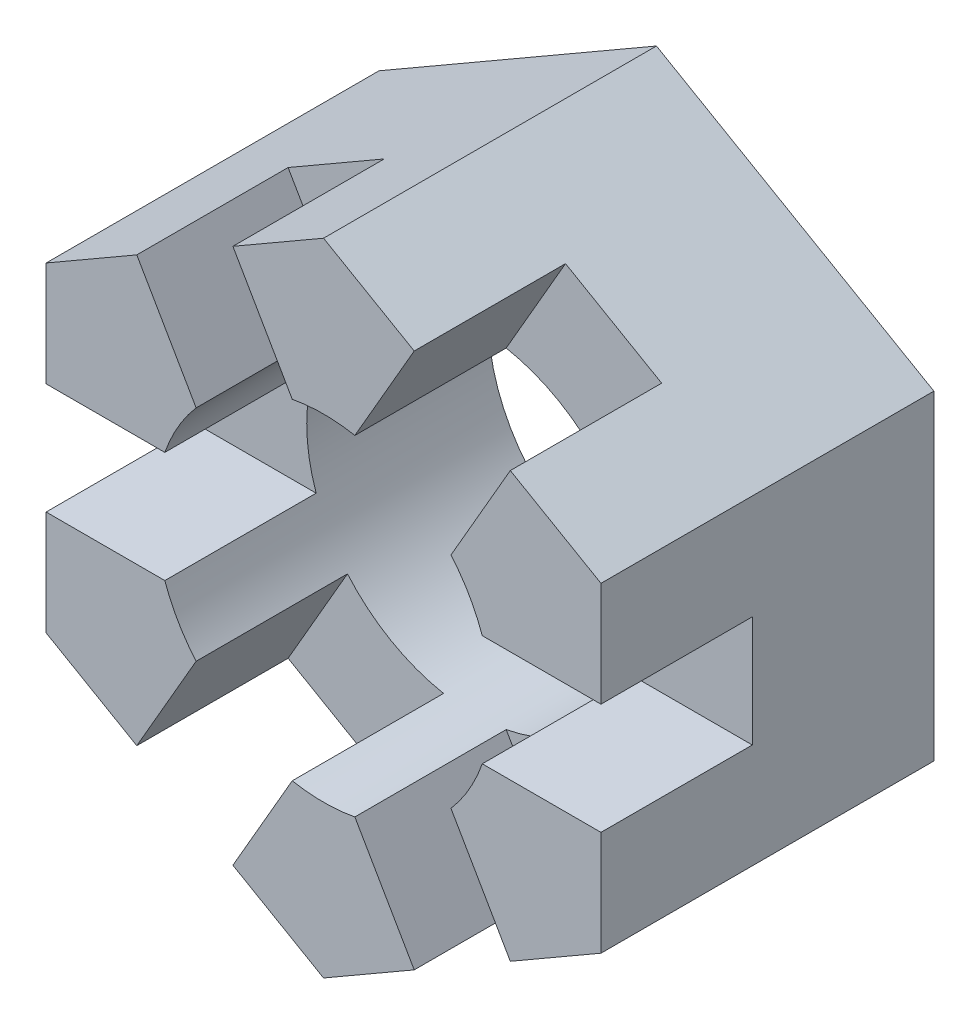
ISO-10303-21;
HEADER;
FILE_DESCRIPTION(('STEP AP214'),'2;1');
FILE_NAME('part.step','',(''),(''),'','','');
FILE_SCHEMA(('AUTOMOTIVE_DESIGN { 1 0 10303 214 1 1 1 1 }'));
ENDSEC;
DATA;
#1=APPLICATION_CONTEXT('core data for automotive mechanical design processes');
#2=APPLICATION_PROTOCOL_DEFINITION('international standard','automotive_design',2000,#1);
#3=PRODUCT_CONTEXT('',#1,'mechanical');
#4=PRODUCT('Part','Part','',(#3));
#5=PRODUCT_RELATED_PRODUCT_CATEGORY('part','',(#4));
#6=PRODUCT_DEFINITION_FORMATION('','',#4);
#7=PRODUCT_DEFINITION_CONTEXT('part definition',#1,'design');
#8=PRODUCT_DEFINITION('design','',#6,#7);
#9=PRODUCT_DEFINITION_SHAPE('','',#8);
#10=(LENGTH_UNIT() NAMED_UNIT(*) SI_UNIT(.MILLI.,.METRE.));
#11=(NAMED_UNIT(*) PLANE_ANGLE_UNIT() SI_UNIT($,.RADIAN.));
#12=(NAMED_UNIT(*) SI_UNIT($,.STERADIAN.) SOLID_ANGLE_UNIT());
#13=UNCERTAINTY_MEASURE_WITH_UNIT(LENGTH_MEASURE(1.E-05),#10,'distance_accuracy_value','');
#14=(GEOMETRIC_REPRESENTATION_CONTEXT(3) GLOBAL_UNCERTAINTY_ASSIGNED_CONTEXT((#13)) GLOBAL_UNIT_ASSIGNED_CONTEXT((#10,
#11,#12)) REPRESENTATION_CONTEXT('',''));
#15=CARTESIAN_POINT('',(0.,0.,0.));
#16=DIRECTION('',(0.,0.,1.));
#17=DIRECTION('',(1.,0.,0.));
#18=AXIS2_PLACEMENT_3D('',#15,#16,#17);
#19=CARTESIAN_POINT('',(0.,0.,0.));
#20=DIRECTION('',(0.,0.,1.));
#21=DIRECTION('',(1.,0.,0.));
#22=AXIS2_PLACEMENT_3D('',#19,#20,#21);
#23=PLANE('',#22);
#24=CARTESIAN_POINT('',(0.,0.,0.));
#25=DIRECTION('',(0.,0.,1.));
#26=DIRECTION('',(1.,0.,0.));
#27=AXIS2_PLACEMENT_3D('',#24,#25,#26);
#28=CIRCLE('',#27,5.);
#29=CARTESIAN_POINT('',(-4.71990466005406,1.65,0.));
#30=VERTEX_POINT('',#29);
#31=CARTESIAN_POINT('',(-4.71990466005406,-1.65,0.));
#32=VERTEX_POINT('',#31);
#33=EDGE_CURVE('E60',#30,#32,#28,.T.);
#34=ORIENTED_EDGE('',*,*,#33,.F.);
#35=DIRECTION('',(1.,0.,0.));
#36=VECTOR('',#35,1.);
#37=CARTESIAN_POINT('',(0.,1.65,0.));
#38=LINE('',#37,#36);
#39=CARTESIAN_POINT('',(-8.25000000000002,1.65,0.));
#40=VERTEX_POINT('',#39);
#41=EDGE_CURVE('E263',#40,#30,#38,.T.);
#42=ORIENTED_EDGE('',*,*,#41,.F.);
#43=DIRECTION('',(0.,-1.,0.));
#44=VECTOR('',#43,1.);
#45=CARTESIAN_POINT('',(-8.25,0.,0.));
#46=LINE('',#45,#44);
#47=CARTESIAN_POINT('',(-8.24999999999999,-1.65,0.));
#48=VERTEX_POINT('',#47);
#49=EDGE_CURVE('E502',#40,#48,#46,.T.);
#50=ORIENTED_EDGE('',*,*,#49,.T.);
#51=DIRECTION('',(1.,0.,0.));
#52=VECTOR('',#51,1.);
#53=CARTESIAN_POINT('',(0.,-1.65,0.));
#54=LINE('',#53,#52);
#55=EDGE_CURVE('E510',#48,#32,#54,.T.);
#56=ORIENTED_EDGE('',*,*,#55,.T.);
#57=EDGE_LOOP('',(#34,#42,#50,#56));
#58=FACE_BOUND('',#57,.T.);
#59=ADVANCED_FACE('F44',(#58),#23,.T.);
#60=DIRECTION('',(0.499999999999998,-0.86602540378444,0.));
#61=VECTOR('',#60,1.);
#62=CARTESIAN_POINT('',(-1.42894191624433,-0.824999999999997,0.));
#63=LINE('',#62,#61);
#64=CARTESIAN_POINT('',(-5.5539419162443,6.31970958122162,0.));
#65=VERTEX_POINT('',#64);
#66=CARTESIAN_POINT('',(-3.78889424627135,3.26255733904738,0.));
#67=VERTEX_POINT('',#66);
#68=EDGE_CURVE('E68',#65,#67,#63,.T.);
#69=ORIENTED_EDGE('',*,*,#68,.T.);
#70=CARTESIAN_POINT('',(-0.931010413782692,4.91255733904737,0.));
#71=VERTEX_POINT('',#70);
#72=EDGE_CURVE('E247',#71,#67,#28,.T.);
#73=ORIENTED_EDGE('',*,*,#72,.F.);
#74=DIRECTION('',(0.499999999999998,-0.86602540378444,0.));
#75=VECTOR('',#74,1.);
#76=CARTESIAN_POINT('',(1.42894191624433,0.824999999999997,0.));
#77=LINE('',#76,#75);
#78=CARTESIAN_POINT('',(-2.69605808375567,7.96970958122164,0.));
#79=VERTEX_POINT('',#78);
#80=EDGE_CURVE('E298',#79,#71,#77,.T.);
#81=ORIENTED_EDGE('',*,*,#80,.F.);
#82=DIRECTION('',(-0.866025403784435,-0.500000000000007,0.));
#83=VECTOR('',#82,1.);
#84=CARTESIAN_POINT('',(-4.12500000000006,7.14470958122159,0.));
#85=LINE('',#84,#83);
#86=EDGE_CURVE('E499',#79,#65,#85,.T.);
#87=ORIENTED_EDGE('',*,*,#86,.T.);
#88=EDGE_LOOP('',(#69,#73,#81,#87));
#89=FACE_BOUND('',#88,.T.);
#90=ADVANCED_FACE('F667',(#89),#23,.T.);
#91=DIRECTION('',(-0.500000000000004,-0.866025403784436,0.));
#92=VECTOR('',#91,1.);
#93=CARTESIAN_POINT('',(-1.42894191624432,0.825000000000007,0.));
#94=LINE('',#93,#92);
#95=CARTESIAN_POINT('',(2.69605808375571,7.9697095812216,0.));
#96=VERTEX_POINT('',#95);
#97=CARTESIAN_POINT('',(0.931010413782727,4.91255733904736,0.));
#98=VERTEX_POINT('',#97);
#99=EDGE_CURVE('E251',#96,#98,#94,.T.);
#100=ORIENTED_EDGE('',*,*,#99,.T.);
#101=CARTESIAN_POINT('',(3.78889424627137,3.26255733904735,0.));
#102=VERTEX_POINT('',#101);
#103=EDGE_CURVE('E642',#102,#98,#28,.T.);
#104=ORIENTED_EDGE('',*,*,#103,.F.);
#105=DIRECTION('',(-0.500000000000004,-0.866025403784436,0.));
#106=VECTOR('',#105,1.);
#107=CARTESIAN_POINT('',(1.42894191624432,-0.825000000000007,0.));
#108=LINE('',#107,#106);
#109=CARTESIAN_POINT('',(5.55394191624436,6.31970958122161,0.));
#110=VERTEX_POINT('',#109);
#111=EDGE_CURVE('E338',#110,#102,#108,.T.);
#112=ORIENTED_EDGE('',*,*,#111,.F.);
#113=DIRECTION('',(-0.866025403784442,0.499999999999995,0.));
#114=VECTOR('',#113,1.);
#115=CARTESIAN_POINT('',(4.12499999999996,7.14470958122165,0.));
#116=LINE('',#115,#114);
#117=EDGE_CURVE('E496',#110,#96,#116,.T.);
#118=ORIENTED_EDGE('',*,*,#117,.T.);
#119=EDGE_LOOP('',(#100,#104,#112,#118));
#120=FACE_BOUND('',#119,.T.);
#121=ADVANCED_FACE('F673',(#120),#23,.T.);
#122=DIRECTION('',(-1.,0.,0.));
#123=VECTOR('',#122,1.);
#124=CARTESIAN_POINT('',(0.,1.65,0.));
#125=LINE('',#124,#123);
#126=CARTESIAN_POINT('',(8.25,1.64999999999995,0.));
#127=VERTEX_POINT('',#126);
#128=CARTESIAN_POINT('',(4.71990466005407,1.64999999999997,0.));
#129=VERTEX_POINT('',#128);
#130=EDGE_CURVE('E332',#127,#129,#125,.T.);
#131=ORIENTED_EDGE('',*,*,#130,.T.);
#132=CARTESIAN_POINT('',(4.71990466005404,-1.65000000000003,0.));
#133=VERTEX_POINT('',#132);
#134=EDGE_CURVE('E603',#133,#129,#28,.T.);
#135=ORIENTED_EDGE('',*,*,#134,.F.);
#136=DIRECTION('',(-1.,0.,0.));
#137=VECTOR('',#136,1.);
#138=CARTESIAN_POINT('',(0.,-1.65,0.));
#139=LINE('',#138,#137);
#140=CARTESIAN_POINT('',(8.25000000000001,-1.65000000000005,0.));
#141=VERTEX_POINT('',#140);
#142=EDGE_CURVE('E379',#141,#133,#139,.T.);
#143=ORIENTED_EDGE('',*,*,#142,.F.);
#144=DIRECTION('',(0.,1.,0.));
#145=VECTOR('',#144,1.);
#146=CARTESIAN_POINT('',(8.25,0.,0.));
#147=LINE('',#146,#145);
#148=EDGE_CURVE('E493',#141,#127,#147,.T.);
#149=ORIENTED_EDGE('',*,*,#148,.T.);
#150=EDGE_LOOP('',(#131,#135,#143,#149));
#151=FACE_BOUND('',#150,.T.);
#152=ADVANCED_FACE('F601',(#151),#23,.T.);
#153=DIRECTION('',(-0.499999999999992,0.866025403784443,0.));
#154=VECTOR('',#153,1.);
#155=CARTESIAN_POINT('',(1.42894191624433,0.824999999999986,0.));
#156=LINE('',#155,#154);
#157=CARTESIAN_POINT('',(5.55394191624426,-6.31970958122166,0.));
#158=VERTEX_POINT('',#157);
#159=CARTESIAN_POINT('',(3.78889424627132,-3.2625573390474,0.));
#160=VERTEX_POINT('',#159);
#161=EDGE_CURVE('E373',#158,#160,#156,.T.);
#162=ORIENTED_EDGE('',*,*,#161,.T.);
#163=CARTESIAN_POINT('',(0.931010413782659,-4.91255733904738,0.));
#164=VERTEX_POINT('',#163);
#165=EDGE_CURVE('E490',#164,#160,#28,.T.);
#166=ORIENTED_EDGE('',*,*,#165,.F.);
#167=DIRECTION('',(-0.499999999999992,0.866025403784443,0.));
#168=VECTOR('',#167,1.);
#169=CARTESIAN_POINT('',(-1.42894191624433,-0.824999999999987,0.));
#170=LINE('',#169,#168);
#171=CARTESIAN_POINT('',(2.69605808375561,-7.96970958122166,0.));
#172=VERTEX_POINT('',#171);
#173=EDGE_CURVE('E420',#172,#164,#170,.T.);
#174=ORIENTED_EDGE('',*,*,#173,.F.);
#175=DIRECTION('',(0.866025403784438,0.500000000000001,0.));
#176=VECTOR('',#175,1.);
#177=CARTESIAN_POINT('',(4.12500000000001,-7.14470958122162,0.));
#178=LINE('',#177,#176);
#179=EDGE_CURVE('E489',#172,#158,#178,.T.);
#180=ORIENTED_EDGE('',*,*,#179,.T.);
#181=EDGE_LOOP('',(#162,#166,#174,#180));
#182=FACE_BOUND('',#181,.T.);
#183=ADVANCED_FACE('F655',(#182),#23,.T.);
#184=CARTESIAN_POINT('',(0.,0.,4.5));
#185=DIRECTION('',(0.,0.,-1.));
#186=DIRECTION('',(-1.,0.,0.));
#187=AXIS2_PLACEMENT_3D('',#184,#185,#186);
#188=CYLINDRICAL_SURFACE('',#187,5.);
#189=DIRECTION('',(0.,0.,-1.));
#190=VECTOR('',#189,1.);
#191=CARTESIAN_POINT('',(-3.78889424627139,-3.26255733904732,4.5));
#192=LINE('',#191,#190);
#193=CARTESIAN_POINT('',(-3.78889424627139,-3.26255733904732,4.5));
#194=VERTEX_POINT('',#193);
#195=CARTESIAN_POINT('',(-3.78889424627139,-3.26255733904732,0.));
#196=VERTEX_POINT('',#195);
#197=EDGE_CURVE('E540',#194,#196,#192,.T.);
#198=ORIENTED_EDGE('',*,*,#197,.T.);
#199=CARTESIAN_POINT('',(-0.931010413782761,-4.91255733904736,0.));
#200=VERTEX_POINT('',#199);
#201=EDGE_CURVE('E485',#196,#200,#28,.T.);
#202=ORIENTED_EDGE('',*,*,#201,.T.);
#203=DIRECTION('',(0.,0.,-1.));
#204=VECTOR('',#203,1.);
#205=CARTESIAN_POINT('',(-0.931010413782762,-4.91255733904736,4.5));
#206=LINE('',#205,#204);
#207=CARTESIAN_POINT('',(-0.931010413782762,-4.91255733904736,4.5));
#208=VERTEX_POINT('',#207);
#209=EDGE_CURVE('E451',#208,#200,#206,.T.);
#210=ORIENTED_EDGE('',*,*,#209,.F.);
#211=CARTESIAN_POINT('',(0.,0.,4.5));
#212=DIRECTION('',(0.,0.,1.));
#213=DIRECTION('',(1.,0.,0.));
#214=AXIS2_PLACEMENT_3D('',#211,#212,#213);
#215=CIRCLE('',#214,5.);
#216=CARTESIAN_POINT('',(0.931010413782659,-4.91255733904738,4.5));
#217=VERTEX_POINT('',#216);
#218=EDGE_CURVE('E415',#208,#217,#215,.T.);
#219=ORIENTED_EDGE('',*,*,#218,.T.);
#220=DIRECTION('',(0.,0.,-1.));
#221=VECTOR('',#220,1.);
#222=CARTESIAN_POINT('',(0.931010413782659,-4.91255733904738,4.5));
#223=LINE('',#222,#221);
#224=EDGE_CURVE('E434',#217,#164,#223,.T.);
#225=ORIENTED_EDGE('',*,*,#224,.T.);
#226=ORIENTED_EDGE('',*,*,#165,.T.);
#227=DIRECTION('',(0.,0.,-1.));
#228=VECTOR('',#227,1.);
#229=CARTESIAN_POINT('',(3.78889424627132,-3.2625573390474,4.5));
#230=LINE('',#229,#228);
#231=CARTESIAN_POINT('',(3.78889424627132,-3.2625573390474,4.5));
#232=VERTEX_POINT('',#231);
#233=EDGE_CURVE('E410',#232,#160,#230,.T.);
#234=ORIENTED_EDGE('',*,*,#233,.F.);
#235=CARTESIAN_POINT('',(0.,0.,4.5));
#236=DIRECTION('',(0.,0.,1.));
#237=DIRECTION('',(1.,0.,0.));
#238=AXIS2_PLACEMENT_3D('',#235,#236,#237);
#239=CIRCLE('',#238,5.);
#240=CARTESIAN_POINT('',(4.71990466005405,-1.65000000000003,4.5));
#241=VERTEX_POINT('',#240);
#242=EDGE_CURVE('E374',#232,#241,#239,.T.);
#243=ORIENTED_EDGE('',*,*,#242,.T.);
#244=DIRECTION('',(0.,0.,-1.));
#245=VECTOR('',#244,1.);
#246=CARTESIAN_POINT('',(4.71990466005405,-1.65000000000003,4.5));
#247=LINE('',#246,#245);
#248=EDGE_CURVE('E393',#241,#133,#247,.T.);
#249=ORIENTED_EDGE('',*,*,#248,.T.);
#250=ORIENTED_EDGE('',*,*,#134,.T.);
#251=DIRECTION('',(0.,0.,-1.));
#252=VECTOR('',#251,1.);
#253=CARTESIAN_POINT('',(4.71990466005407,1.64999999999997,4.5));
#254=LINE('',#253,#252);
#255=CARTESIAN_POINT('',(4.71990466005407,1.64999999999997,4.5));
#256=VERTEX_POINT('',#255);
#257=EDGE_CURVE('E369',#256,#129,#254,.T.);
#258=ORIENTED_EDGE('',*,*,#257,.F.);
#259=CARTESIAN_POINT('',(0.,0.,4.5));
#260=DIRECTION('',(0.,0.,1.));
#261=DIRECTION('',(1.,0.,0.));
#262=AXIS2_PLACEMENT_3D('',#259,#260,#261);
#263=CIRCLE('',#262,5.);
#264=CARTESIAN_POINT('',(3.78889424627137,3.26255733904735,4.5));
#265=VERTEX_POINT('',#264);
#266=EDGE_CURVE('E333',#256,#265,#263,.T.);
#267=ORIENTED_EDGE('',*,*,#266,.T.);
#268=DIRECTION('',(0.,0.,-1.));
#269=VECTOR('',#268,1.);
#270=CARTESIAN_POINT('',(3.78889424627137,3.26255733904735,4.5));
#271=LINE('',#270,#269);
#272=EDGE_CURVE('E352',#265,#102,#271,.T.);
#273=ORIENTED_EDGE('',*,*,#272,.T.);
#274=ORIENTED_EDGE('',*,*,#103,.T.);
#275=DIRECTION('',(0.,0.,-1.));
#276=VECTOR('',#275,1.);
#277=CARTESIAN_POINT('',(0.931010413782728,4.91255733904736,4.5));
#278=LINE('',#277,#276);
#279=CARTESIAN_POINT('',(0.931010413782728,4.91255733904736,4.5));
#280=VERTEX_POINT('',#279);
#281=EDGE_CURVE('E328',#280,#98,#278,.T.);
#282=ORIENTED_EDGE('',*,*,#281,.F.);
#283=CARTESIAN_POINT('',(0.,0.,4.5));
#284=DIRECTION('',(0.,0.,1.));
#285=DIRECTION('',(1.,0.,0.));
#286=AXIS2_PLACEMENT_3D('',#283,#284,#285);
#287=CIRCLE('',#286,5.);
#288=CARTESIAN_POINT('',(-0.931010413782692,4.91255733904737,4.5));
#289=VERTEX_POINT('',#288);
#290=EDGE_CURVE('E293',#280,#289,#287,.T.);
#291=ORIENTED_EDGE('',*,*,#290,.T.);
#292=DIRECTION('',(0.,0.,-1.));
#293=VECTOR('',#292,1.);
#294=CARTESIAN_POINT('',(-0.931010413782692,4.91255733904737,4.5));
#295=LINE('',#294,#293);
#296=EDGE_CURVE('E312',#289,#71,#295,.T.);
#297=ORIENTED_EDGE('',*,*,#296,.T.);
#298=ORIENTED_EDGE('',*,*,#72,.T.);
#299=DIRECTION('',(0.,0.,-1.));
#300=VECTOR('',#299,1.);
#301=CARTESIAN_POINT('',(-3.78889424627134,3.26255733904738,4.5));
#302=LINE('',#301,#300);
#303=CARTESIAN_POINT('',(-3.78889424627134,3.26255733904738,4.5));
#304=VERTEX_POINT('',#303);
#305=EDGE_CURVE('E242',#304,#67,#302,.T.);
#306=ORIENTED_EDGE('',*,*,#305,.F.);
#307=CARTESIAN_POINT('',(0.,0.,4.5));
#308=DIRECTION('',(0.,0.,1.));
#309=DIRECTION('',(1.,0.,0.));
#310=AXIS2_PLACEMENT_3D('',#307,#308,#309);
#311=CIRCLE('',#310,5.);
#312=CARTESIAN_POINT('',(-4.71990466005406,1.65,4.5));
#313=VERTEX_POINT('',#312);
#314=EDGE_CURVE('E245',#304,#313,#311,.T.);
#315=ORIENTED_EDGE('',*,*,#314,.T.);
#316=DIRECTION('',(0.,0.,-1.));
#317=VECTOR('',#316,1.);
#318=CARTESIAN_POINT('',(-4.71990466005406,1.65,4.5));
#319=LINE('',#318,#317);
#320=EDGE_CURVE('E279',#313,#30,#319,.T.);
#321=ORIENTED_EDGE('',*,*,#320,.T.);
#322=ORIENTED_EDGE('',*,*,#33,.T.);
#323=DIRECTION('',(0.,0.,-1.));
#324=VECTOR('',#323,1.);
#325=CARTESIAN_POINT('',(-4.71990466005406,-1.65,4.5));
#326=LINE('',#325,#324);
#327=CARTESIAN_POINT('',(-4.71990466005406,-1.65,4.5));
#328=VERTEX_POINT('',#327);
#329=EDGE_CURVE('E11',#328,#32,#326,.T.);
#330=ORIENTED_EDGE('',*,*,#329,.F.);
#331=CARTESIAN_POINT('',(0.,0.,4.5));
#332=DIRECTION('',(0.,0.,1.));
#333=DIRECTION('',(1.,0.,0.));
#334=AXIS2_PLACEMENT_3D('',#331,#332,#333);
#335=CIRCLE('',#334,5.);
#336=EDGE_CURVE('E522',#328,#194,#335,.T.);
#337=ORIENTED_EDGE('',*,*,#336,.T.);
#338=EDGE_LOOP('',(#198,#202,#210,#219,#225,#226,#234,#243,#249,#250,#258,#267,#273,#274,#282,
#291,#297,#298,#306,#315,#321,#322,#330,#337));
#339=FACE_BOUND('',#338,.T.);
#340=CARTESIAN_POINT('',(0.,0.,-5.4));
#341=DIRECTION('',(0.,0.,1.));
#342=DIRECTION('',(1.,0.,0.));
#343=AXIS2_PLACEMENT_3D('',#340,#341,#342);
#344=CIRCLE('',#343,5.);
#345=CARTESIAN_POINT('',(5.,0.,-5.4));
#346=VERTEX_POINT('',#345);
#347=EDGE_CURVE('E455',#346,#346,#344,.T.);
#348=ORIENTED_EDGE('',*,*,#347,.F.);
#349=EDGE_LOOP('',(#348));
#350=FACE_BOUND('',#349,.T.);
#351=ADVANCED_FACE('F46',(#339,#350),#188,.F.);
#352=CARTESIAN_POINT('',(0.,-1.65,4.5));
#353=DIRECTION('',(0.,1.,0.));
#354=DIRECTION('',(-1.,0.,0.));
#355=AXIS2_PLACEMENT_3D('',#352,#353,#354);
#356=PLANE('',#355);
#357=ORIENTED_EDGE('',*,*,#55,.F.);
#358=DIRECTION('',(0.,0.,-1.));
#359=VECTOR('',#358,1.);
#360=CARTESIAN_POINT('',(-8.24999999999999,-1.65,4.5));
#361=LINE('',#360,#359);
#362=CARTESIAN_POINT('',(-8.24999999999999,-1.65,4.5));
#363=VERTEX_POINT('',#362);
#364=EDGE_CURVE('E53',#363,#48,#361,.T.);
#365=ORIENTED_EDGE('',*,*,#364,.F.);
#366=DIRECTION('',(1.,0.,0.));
#367=VECTOR('',#366,1.);
#368=CARTESIAN_POINT('',(0.,-1.65,4.5));
#369=LINE('',#368,#367);
#370=EDGE_CURVE('E526',#363,#328,#369,.T.);
#371=ORIENTED_EDGE('',*,*,#370,.T.);
#372=ORIENTED_EDGE('',*,*,#329,.T.);
#373=EDGE_LOOP('',(#357,#365,#371,#372));
#374=FACE_BOUND('',#373,.T.);
#375=ADVANCED_FACE('F564',(#374),#356,.T.);
#376=CARTESIAN_POINT('',(-8.25,0.,4.5));
#377=DIRECTION('',(1.,0.,0.));
#378=DIRECTION('',(0.,1.,0.));
#379=AXIS2_PLACEMENT_3D('',#376,#377,#378);
#380=PLANE('',#379);
#381=ORIENTED_EDGE('',*,*,#364,.T.);
#382=ORIENTED_EDGE('',*,*,#49,.F.);
#383=DIRECTION('',(0.,0.,-1.));
#384=VECTOR('',#383,1.);
#385=CARTESIAN_POINT('',(-8.25000000000002,1.65,4.5));
#386=LINE('',#385,#384);
#387=CARTESIAN_POINT('',(-8.25000000000002,1.65,4.5));
#388=VERTEX_POINT('',#387);
#389=EDGE_CURVE('E287',#388,#40,#386,.T.);
#390=ORIENTED_EDGE('',*,*,#389,.F.);
#391=DIRECTION('',(0.,-1.,0.));
#392=VECTOR('',#391,1.);
#393=CARTESIAN_POINT('',(-8.25,0.,4.5));
#394=LINE('',#393,#392);
#395=CARTESIAN_POINT('',(-8.25000000000005,4.76313972081434,4.5));
#396=VERTEX_POINT('',#395);
#397=EDGE_CURVE('E272',#396,#388,#394,.T.);
#398=ORIENTED_EDGE('',*,*,#397,.F.);
#399=DIRECTION('',(0.,0.,1.));
#400=VECTOR('',#399,1.);
#401=CARTESIAN_POINT('',(-8.25000000000005,4.76313972081434,-5.4));
#402=LINE('',#401,#400);
#403=CARTESIAN_POINT('',(-8.25000000000005,4.76313972081434,-5.4));
#404=VERTEX_POINT('',#403);
#405=EDGE_CURVE('E511',#404,#396,#402,.T.);
#406=ORIENTED_EDGE('',*,*,#405,.F.);
#407=DIRECTION('',(0.,-1.,0.));
#408=VECTOR('',#407,1.);
#409=CARTESIAN_POINT('',(-8.25,0.,-5.4));
#410=LINE('',#409,#408);
#411=CARTESIAN_POINT('',(-8.24999999999996,-4.76313972081451,-5.4));
#412=VERTEX_POINT('',#411);
#413=EDGE_CURVE('E476',#404,#412,#410,.T.);
#414=ORIENTED_EDGE('',*,*,#413,.T.);
#415=DIRECTION('',(0.,0.,-1.));
#416=VECTOR('',#415,1.);
#417=CARTESIAN_POINT('',(-8.24999999999996,-4.76313972081451,4.5));
#418=LINE('',#417,#416);
#419=CARTESIAN_POINT('',(-8.24999999999996,-4.76313972081451,4.5));
#420=VERTEX_POINT('',#419);
#421=EDGE_CURVE('E551',#420,#412,#418,.T.);
#422=ORIENTED_EDGE('',*,*,#421,.F.);
#423=DIRECTION('',(0.,-1.,0.));
#424=VECTOR('',#423,1.);
#425=CARTESIAN_POINT('',(-8.25,0.,4.5));
#426=LINE('',#425,#424);
#427=EDGE_CURVE('E531',#363,#420,#426,.T.);
#428=ORIENTED_EDGE('',*,*,#427,.F.);
#429=EDGE_LOOP('',(#381,#382,#390,#398,#406,#414,#422,#428));
#430=FACE_BOUND('',#429,.T.);
#431=ADVANCED_FACE('F559',(#430),#380,.F.);
#432=CARTESIAN_POINT('',(-4.12499999999998,-7.14470958122167,4.5));
#433=DIRECTION('',(0.499999999999995,0.866025403784441,0.));
#434=DIRECTION('',(-0.866025403784441,0.499999999999995,0.));
#435=AXIS2_PLACEMENT_3D('',#432,#433,#434);
#436=PLANE('',#435);
#437=ORIENTED_EDGE('',*,*,#421,.T.);
#438=DIRECTION('',(0.866025403784441,-0.499999999999995,0.));
#439=VECTOR('',#438,1.);
#440=CARTESIAN_POINT('',(-4.12499999999998,-7.14470958122167,-5.4));
#441=LINE('',#440,#439);
#442=CARTESIAN_POINT('',(0.,-9.52627944162884,-5.4));
#443=VERTEX_POINT('',#442);
#444=EDGE_CURVE('E480',#412,#443,#441,.T.);
#445=ORIENTED_EDGE('',*,*,#444,.T.);
#446=DIRECTION('',(0.,0.,1.));
#447=VECTOR('',#446,1.);
#448=CARTESIAN_POINT('',(0.,-9.52627944162884,-5.4));
#449=LINE('',#448,#447);
#450=CARTESIAN_POINT('',(0.,-9.52627944162884,4.5));
#451=VERTEX_POINT('',#450);
#452=EDGE_CURVE('E507',#443,#451,#449,.T.);
#453=ORIENTED_EDGE('',*,*,#452,.T.);
#454=DIRECTION('',(0.866025403784441,-0.499999999999995,0.));
#455=VECTOR('',#454,1.);
#456=CARTESIAN_POINT('',(-4.12499999999998,-7.14470958122167,4.5));
#457=LINE('',#456,#455);
#458=CARTESIAN_POINT('',(-2.69605808375577,-7.96970958122159,4.5));
#459=VERTEX_POINT('',#458);
#460=EDGE_CURVE('E424',#459,#451,#457,.T.);
#461=ORIENTED_EDGE('',*,*,#460,.F.);
#462=DIRECTION('',(0.,0.,-1.));
#463=VECTOR('',#462,1.);
#464=CARTESIAN_POINT('',(-2.69605808375577,-7.96970958122159,4.5));
#465=LINE('',#464,#463);
#466=CARTESIAN_POINT('',(-2.69605808375577,-7.96970958122159,0.));
#467=VERTEX_POINT('',#466);
#468=EDGE_CURVE('E447',#459,#467,#465,.T.);
#469=ORIENTED_EDGE('',*,*,#468,.T.);
#470=DIRECTION('',(0.866025403784441,-0.499999999999995,0.));
#471=VECTOR('',#470,1.);
#472=CARTESIAN_POINT('',(-4.12499999999998,-7.14470958122167,0.));
#473=LINE('',#472,#471);
#474=CARTESIAN_POINT('',(-5.55394191624443,-6.31970958122161,0.));
#475=VERTEX_POINT('',#474);
#476=EDGE_CURVE('E460',#475,#467,#473,.T.);
#477=ORIENTED_EDGE('',*,*,#476,.F.);
#478=DIRECTION('',(0.,0.,-1.));
#479=VECTOR('',#478,1.);
#480=CARTESIAN_POINT('',(-5.55394191624443,-6.31970958122161,4.5));
#481=LINE('',#480,#479);
#482=CARTESIAN_POINT('',(-5.55394191624443,-6.31970958122161,4.5));
#483=VERTEX_POINT('',#482);
#484=EDGE_CURVE('E548',#483,#475,#481,.T.);
#485=ORIENTED_EDGE('',*,*,#484,.F.);
#486=DIRECTION('',(0.866025403784441,-0.499999999999995,0.));
#487=VECTOR('',#486,1.);
#488=CARTESIAN_POINT('',(-4.12499999999998,-7.14470958122167,4.5));
#489=LINE('',#488,#487);
#490=EDGE_CURVE('E534',#420,#483,#489,.T.);
#491=ORIENTED_EDGE('',*,*,#490,.F.);
#492=EDGE_LOOP('',(#437,#445,#453,#461,#469,#477,#485,#491));
#493=FACE_BOUND('',#492,.T.);
#494=ADVANCED_FACE('F618',(#493),#436,.F.);
#495=CARTESIAN_POINT('',(-1.42894191624431,0.825000000000017,4.5));
#496=DIRECTION('',(-0.866025403784433,0.50000000000001,0.));
#497=DIRECTION('',(-0.50000000000001,-0.866025403784433,0.));
#498=AXIS2_PLACEMENT_3D('',#495,#496,#497);
#499=PLANE('',#498);
#500=DIRECTION('',(0.50000000000001,0.866025403784433,0.));
#501=VECTOR('',#500,1.);
#502=CARTESIAN_POINT('',(-1.42894191624431,0.825000000000017,0.));
#503=LINE('',#502,#501);
#504=EDGE_CURVE('E527',#475,#196,#503,.T.);
#505=ORIENTED_EDGE('',*,*,#504,.T.);
#506=ORIENTED_EDGE('',*,*,#197,.F.);
#507=DIRECTION('',(0.50000000000001,0.866025403784433,0.));
#508=VECTOR('',#507,1.);
#509=CARTESIAN_POINT('',(-1.42894191624431,0.825000000000017,4.5));
#510=LINE('',#509,#508);
#511=EDGE_CURVE('E537',#483,#194,#510,.T.);
#512=ORIENTED_EDGE('',*,*,#511,.F.);
#513=ORIENTED_EDGE('',*,*,#484,.T.);
#514=EDGE_LOOP('',(#505,#506,#512,#513));
#515=FACE_BOUND('',#514,.T.);
#516=ADVANCED_FACE('F636',(#515),#499,.F.);
#517=CARTESIAN_POINT('',(0.,0.,4.5));
#518=DIRECTION('',(0.,0.,1.));
#519=DIRECTION('',(1.,0.,0.));
#520=AXIS2_PLACEMENT_3D('',#517,#518,#519);
#521=PLANE('',#520);
#522=ORIENTED_EDGE('',*,*,#336,.F.);
#523=ORIENTED_EDGE('',*,*,#370,.F.);
#524=ORIENTED_EDGE('',*,*,#427,.T.);
#525=ORIENTED_EDGE('',*,*,#490,.T.);
#526=ORIENTED_EDGE('',*,*,#511,.T.);
#527=EDGE_LOOP('',(#522,#523,#524,#525,#526));
#528=FACE_BOUND('',#527,.T.);
#529=ADVANCED_FACE('F639',(#528),#521,.T.);
#530=DIRECTION('',(0.50000000000001,0.866025403784433,0.));
#531=VECTOR('',#530,1.);
#532=CARTESIAN_POINT('',(1.42894191624431,-0.825000000000016,0.));
#533=LINE('',#532,#531);
#534=EDGE_CURVE('E414',#467,#200,#533,.T.);
#535=ORIENTED_EDGE('',*,*,#534,.T.);
#536=ORIENTED_EDGE('',*,*,#201,.F.);
#537=ORIENTED_EDGE('',*,*,#504,.F.);
#538=ORIENTED_EDGE('',*,*,#476,.T.);
#539=EDGE_LOOP('',(#535,#536,#537,#538));
#540=FACE_BOUND('',#539,.T.);
#541=ADVANCED_FACE('F632',(#540),#23,.T.);
#542=CARTESIAN_POINT('',(4.12500000000001,-7.14470958122162,-5.4));
#543=DIRECTION('',(0.500000000000001,-0.866025403784438,0.));
#544=DIRECTION('',(0.866025403784438,0.500000000000001,0.));
#545=AXIS2_PLACEMENT_3D('',#542,#543,#544);
#546=PLANE('',#545);
#547=ORIENTED_EDGE('',*,*,#179,.F.);
#548=DIRECTION('',(0.,0.,-1.));
#549=VECTOR('',#548,1.);
#550=CARTESIAN_POINT('',(2.69605808375561,-7.96970958122166,4.5));
#551=LINE('',#550,#549);
#552=CARTESIAN_POINT('',(2.69605808375561,-7.96970958122166,4.5));
#553=VERTEX_POINT('',#552);
#554=EDGE_CURVE('E443',#553,#172,#551,.T.);
#555=ORIENTED_EDGE('',*,*,#554,.F.);
#556=DIRECTION('',(0.866025403784438,0.500000000000001,0.));
#557=VECTOR('',#556,1.);
#558=CARTESIAN_POINT('',(4.12500000000001,-7.14470958122162,4.5));
#559=LINE('',#558,#557);
#560=EDGE_CURVE('E428',#451,#553,#559,.T.);
#561=ORIENTED_EDGE('',*,*,#560,.F.);
#562=ORIENTED_EDGE('',*,*,#452,.F.);
#563=DIRECTION('',(0.866025403784438,0.500000000000001,0.));
#564=VECTOR('',#563,1.);
#565=CARTESIAN_POINT('',(4.12500000000001,-7.14470958122162,-5.4));
#566=LINE('',#565,#564);
#567=CARTESIAN_POINT('',(8.25000000000002,-4.7631397208144,-5.4));
#568=VERTEX_POINT('',#567);
#569=EDGE_CURVE('E459',#443,#568,#566,.T.);
#570=ORIENTED_EDGE('',*,*,#569,.T.);
#571=DIRECTION('',(0.,0.,1.));
#572=VECTOR('',#571,1.);
#573=CARTESIAN_POINT('',(8.25000000000002,-4.7631397208144,-5.4));
#574=LINE('',#573,#572);
#575=CARTESIAN_POINT('',(8.25000000000002,-4.7631397208144,4.5));
#576=VERTEX_POINT('',#575);
#577=EDGE_CURVE('E484',#568,#576,#574,.T.);
#578=ORIENTED_EDGE('',*,*,#577,.T.);
#579=DIRECTION('',(0.866025403784438,0.500000000000001,0.));
#580=VECTOR('',#579,1.);
#581=CARTESIAN_POINT('',(4.12500000000001,-7.14470958122162,4.5));
#582=LINE('',#581,#580);
#583=CARTESIAN_POINT('',(5.55394191624426,-6.31970958122166,4.5));
#584=VERTEX_POINT('',#583);
#585=EDGE_CURVE('E383',#584,#576,#582,.T.);
#586=ORIENTED_EDGE('',*,*,#585,.F.);
#587=DIRECTION('',(0.,0.,-1.));
#588=VECTOR('',#587,1.);
#589=CARTESIAN_POINT('',(5.55394191624426,-6.31970958122166,4.5));
#590=LINE('',#589,#588);
#591=EDGE_CURVE('E406',#584,#158,#590,.T.);
#592=ORIENTED_EDGE('',*,*,#591,.T.);
#593=EDGE_LOOP('',(#547,#555,#561,#562,#570,#578,#586,#592));
#594=FACE_BOUND('',#593,.T.);
#595=ADVANCED_FACE('F613',(#594),#546,.T.);
#596=CARTESIAN_POINT('',(-4.12500000000006,7.14470958122159,-5.4));
#597=DIRECTION('',(-0.500000000000007,0.866025403784435,0.));
#598=DIRECTION('',(-0.866025403784435,-0.500000000000007,0.));
#599=AXIS2_PLACEMENT_3D('',#596,#597,#598);
#600=PLANE('',#599);
#601=ORIENTED_EDGE('',*,*,#86,.F.);
#602=DIRECTION('',(0.,0.,-1.));
#603=VECTOR('',#602,1.);
#604=CARTESIAN_POINT('',(-2.69605808375567,7.96970958122164,4.5));
#605=LINE('',#604,#603);
#606=CARTESIAN_POINT('',(-2.69605808375567,7.96970958122164,4.5));
#607=VERTEX_POINT('',#606);
#608=EDGE_CURVE('E320',#607,#79,#605,.T.);
#609=ORIENTED_EDGE('',*,*,#608,.F.);
#610=DIRECTION('',(-0.866025403784435,-0.500000000000007,0.));
#611=VECTOR('',#610,1.);
#612=CARTESIAN_POINT('',(-4.12500000000006,7.14470958122159,4.5));
#613=LINE('',#612,#611);
#614=CARTESIAN_POINT('',(0.,9.52627944162884,4.5));
#615=VERTEX_POINT('',#614);
#616=EDGE_CURVE('E306',#615,#607,#613,.T.);
#617=ORIENTED_EDGE('',*,*,#616,.F.);
#618=DIRECTION('',(0.,0.,1.));
#619=VECTOR('',#618,1.);
#620=CARTESIAN_POINT('',(0.,9.52627944162884,-5.4));
#621=LINE('',#620,#619);
#622=CARTESIAN_POINT('',(0.,9.52627944162884,-5.4));
#623=VERTEX_POINT('',#622);
#624=EDGE_CURVE('E514',#623,#615,#621,.T.);
#625=ORIENTED_EDGE('',*,*,#624,.F.);
#626=DIRECTION('',(-0.866025403784435,-0.500000000000007,0.));
#627=VECTOR('',#626,1.);
#628=CARTESIAN_POINT('',(-4.12500000000006,7.14470958122159,-5.4));
#629=LINE('',#628,#627);
#630=EDGE_CURVE('E472',#623,#404,#629,.T.);
#631=ORIENTED_EDGE('',*,*,#630,.T.);
#632=ORIENTED_EDGE('',*,*,#405,.T.);
#633=DIRECTION('',(-0.866025403784435,-0.500000000000007,0.));
#634=VECTOR('',#633,1.);
#635=CARTESIAN_POINT('',(-4.12500000000006,7.14470958122159,4.5));
#636=LINE('',#635,#634);
#637=CARTESIAN_POINT('',(-5.5539419162443,6.31970958122162,4.5));
#638=VERTEX_POINT('',#637);
#639=EDGE_CURVE('E269',#638,#396,#636,.T.);
#640=ORIENTED_EDGE('',*,*,#639,.F.);
#641=DIRECTION('',(0.,0.,-1.));
#642=VECTOR('',#641,1.);
#643=CARTESIAN_POINT('',(-5.5539419162443,6.31970958122162,4.5));
#644=LINE('',#643,#642);
#645=EDGE_CURVE('E252',#638,#65,#644,.T.);
#646=ORIENTED_EDGE('',*,*,#645,.T.);
#647=EDGE_LOOP('',(#601,#609,#617,#625,#631,#632,#640,#646));
#648=FACE_BOUND('',#647,.T.);
#649=ADVANCED_FACE('F571',(#648),#600,.T.);
#650=CARTESIAN_POINT('',(4.12499999999996,7.14470958122165,-5.4));
#651=DIRECTION('',(0.499999999999995,0.866025403784441,0.));
#652=DIRECTION('',(-0.866025403784442,0.499999999999995,0.));
#653=AXIS2_PLACEMENT_3D('',#650,#651,#652);
#654=PLANE('',#653);
#655=ORIENTED_EDGE('',*,*,#117,.F.);
#656=DIRECTION('',(0.,0.,-1.));
#657=VECTOR('',#656,1.);
#658=CARTESIAN_POINT('',(5.55394191624436,6.31970958122161,4.5));
#659=LINE('',#658,#657);
#660=CARTESIAN_POINT('',(5.55394191624436,6.31970958122161,4.5));
#661=VERTEX_POINT('',#660);
#662=EDGE_CURVE('E361',#661,#110,#659,.T.);
#663=ORIENTED_EDGE('',*,*,#662,.F.);
#664=DIRECTION('',(-0.866025403784442,0.499999999999995,0.));
#665=VECTOR('',#664,1.);
#666=CARTESIAN_POINT('',(4.12499999999996,7.14470958122165,4.5));
#667=LINE('',#666,#665);
#668=CARTESIAN_POINT('',(8.24999999999999,4.76313972081445,4.5));
#669=VERTEX_POINT('',#668);
#670=EDGE_CURVE('E346',#669,#661,#667,.T.);
#671=ORIENTED_EDGE('',*,*,#670,.F.);
#672=DIRECTION('',(0.,0.,1.));
#673=VECTOR('',#672,1.);
#674=CARTESIAN_POINT('',(8.24999999999999,4.76313972081445,-5.4));
#675=LINE('',#674,#673);
#676=CARTESIAN_POINT('',(8.24999999999999,4.76313972081445,-5.4));
#677=VERTEX_POINT('',#676);
#678=EDGE_CURVE('E517',#677,#669,#675,.T.);
#679=ORIENTED_EDGE('',*,*,#678,.F.);
#680=DIRECTION('',(-0.866025403784442,0.499999999999995,0.));
#681=VECTOR('',#680,1.);
#682=CARTESIAN_POINT('',(4.12499999999996,7.14470958122165,-5.4));
#683=LINE('',#682,#681);
#684=EDGE_CURVE('E468',#677,#623,#683,.T.);
#685=ORIENTED_EDGE('',*,*,#684,.T.);
#686=ORIENTED_EDGE('',*,*,#624,.T.);
#687=DIRECTION('',(-0.866025403784442,0.499999999999995,0.));
#688=VECTOR('',#687,1.);
#689=CARTESIAN_POINT('',(4.12499999999996,7.14470958122165,4.5));
#690=LINE('',#689,#688);
#691=CARTESIAN_POINT('',(2.69605808375571,7.9697095812216,4.5));
#692=VERTEX_POINT('',#691);
#693=EDGE_CURVE('E302',#692,#615,#690,.T.);
#694=ORIENTED_EDGE('',*,*,#693,.F.);
#695=DIRECTION('',(0.,0.,-1.));
#696=VECTOR('',#695,1.);
#697=CARTESIAN_POINT('',(2.69605808375571,7.9697095812216,4.5));
#698=LINE('',#697,#696);
#699=EDGE_CURVE('E324',#692,#96,#698,.T.);
#700=ORIENTED_EDGE('',*,*,#699,.T.);
#701=EDGE_LOOP('',(#655,#663,#671,#679,#685,#686,#694,#700));
#702=FACE_BOUND('',#701,.T.);
#703=ADVANCED_FACE('F582',(#702),#654,.T.);
#704=CARTESIAN_POINT('',(8.25,0.,-5.4));
#705=DIRECTION('',(1.,0.,0.));
#706=DIRECTION('',(0.,1.,0.));
#707=AXIS2_PLACEMENT_3D('',#704,#705,#706);
#708=PLANE('',#707);
#709=ORIENTED_EDGE('',*,*,#148,.F.);
#710=DIRECTION('',(0.,0.,-1.));
#711=VECTOR('',#710,1.);
#712=CARTESIAN_POINT('',(8.25000000000001,-1.65000000000005,4.5));
#713=LINE('',#712,#711);
#714=CARTESIAN_POINT('',(8.25000000000001,-1.65000000000005,4.5));
#715=VERTEX_POINT('',#714);
#716=EDGE_CURVE('E402',#715,#141,#713,.T.);
#717=ORIENTED_EDGE('',*,*,#716,.F.);
#718=DIRECTION('',(0.,1.,0.));
#719=VECTOR('',#718,1.);
#720=CARTESIAN_POINT('',(8.25,0.,4.5));
#721=LINE('',#720,#719);
#722=EDGE_CURVE('E387',#576,#715,#721,.T.);
#723=ORIENTED_EDGE('',*,*,#722,.F.);
#724=ORIENTED_EDGE('',*,*,#577,.F.);
#725=DIRECTION('',(0.,1.,0.));
#726=VECTOR('',#725,1.);
#727=CARTESIAN_POINT('',(8.25,0.,-5.4));
#728=LINE('',#727,#726);
#729=EDGE_CURVE('E464',#568,#677,#728,.T.);
#730=ORIENTED_EDGE('',*,*,#729,.T.);
#731=ORIENTED_EDGE('',*,*,#678,.T.);
#732=DIRECTION('',(0.,1.,0.));
#733=VECTOR('',#732,1.);
#734=CARTESIAN_POINT('',(8.25,0.,4.5));
#735=LINE('',#734,#733);
#736=CARTESIAN_POINT('',(8.25,1.64999999999995,4.5));
#737=VERTEX_POINT('',#736);
#738=EDGE_CURVE('E342',#737,#669,#735,.T.);
#739=ORIENTED_EDGE('',*,*,#738,.F.);
#740=DIRECTION('',(0.,0.,-1.));
#741=VECTOR('',#740,1.);
#742=CARTESIAN_POINT('',(8.25,1.64999999999995,4.5));
#743=LINE('',#742,#741);
#744=EDGE_CURVE('E365',#737,#127,#743,.T.);
#745=ORIENTED_EDGE('',*,*,#744,.T.);
#746=EDGE_LOOP('',(#709,#717,#723,#724,#730,#731,#739,#745));
#747=FACE_BOUND('',#746,.T.);
#748=ADVANCED_FACE('F588',(#747),#708,.T.);
#749=CARTESIAN_POINT('',(0.,0.,-5.4));
#750=DIRECTION('',(0.,0.,1.));
#751=DIRECTION('',(1.,0.,0.));
#752=AXIS2_PLACEMENT_3D('',#749,#750,#751);
#753=PLANE('',#752);
#754=ORIENTED_EDGE('',*,*,#347,.T.);
#755=EDGE_LOOP('',(#754));
#756=FACE_BOUND('',#755,.T.);
#757=ORIENTED_EDGE('',*,*,#569,.F.);
#758=ORIENTED_EDGE('',*,*,#444,.F.);
#759=ORIENTED_EDGE('',*,*,#413,.F.);
#760=ORIENTED_EDGE('',*,*,#630,.F.);
#761=ORIENTED_EDGE('',*,*,#684,.F.);
#762=ORIENTED_EDGE('',*,*,#729,.F.);
#763=EDGE_LOOP('',(#757,#758,#759,#760,#761,#762));
#764=FACE_BOUND('',#763,.T.);
#765=ADVANCED_FACE('F577',(#756,#764),#753,.F.);
#766=CARTESIAN_POINT('',(1.42894191624431,-0.825000000000016,4.5));
#767=DIRECTION('',(-0.866025403784433,0.50000000000001,0.));
#768=DIRECTION('',(-0.50000000000001,-0.866025403784433,0.));
#769=AXIS2_PLACEMENT_3D('',#766,#767,#768);
#770=PLANE('',#769);
#771=ORIENTED_EDGE('',*,*,#534,.F.);
#772=ORIENTED_EDGE('',*,*,#468,.F.);
#773=DIRECTION('',(0.50000000000001,0.866025403784433,0.));
#774=VECTOR('',#773,1.);
#775=CARTESIAN_POINT('',(1.42894191624431,-0.825000000000016,4.5));
#776=LINE('',#775,#774);
#777=EDGE_CURVE('E419',#459,#208,#776,.T.);
#778=ORIENTED_EDGE('',*,*,#777,.T.);
#779=ORIENTED_EDGE('',*,*,#209,.T.);
#780=EDGE_LOOP('',(#771,#772,#778,#779));
#781=FACE_BOUND('',#780,.T.);
#782=ADVANCED_FACE('F625',(#781),#770,.T.);
#783=CARTESIAN_POINT('',(-1.42894191624433,-0.824999999999987,4.5));
#784=DIRECTION('',(-0.866025403784443,-0.499999999999992,0.));
#785=DIRECTION('',(0.499999999999992,-0.866025403784443,0.));
#786=AXIS2_PLACEMENT_3D('',#783,#784,#785);
#787=PLANE('',#786);
#788=ORIENTED_EDGE('',*,*,#173,.T.);
#789=ORIENTED_EDGE('',*,*,#224,.F.);
#790=DIRECTION('',(-0.499999999999992,0.866025403784443,0.));
#791=VECTOR('',#790,1.);
#792=CARTESIAN_POINT('',(-1.42894191624433,-0.824999999999987,4.5));
#793=LINE('',#792,#791);
#794=EDGE_CURVE('E431',#553,#217,#793,.T.);
#795=ORIENTED_EDGE('',*,*,#794,.F.);
#796=ORIENTED_EDGE('',*,*,#554,.T.);
#797=EDGE_LOOP('',(#788,#789,#795,#796));
#798=FACE_BOUND('',#797,.T.);
#799=ADVANCED_FACE('F657',(#798),#787,.F.);
#800=CARTESIAN_POINT('',(0.,0.,4.5));
#801=DIRECTION('',(0.,0.,1.));
#802=DIRECTION('',(1.,0.,0.));
#803=AXIS2_PLACEMENT_3D('',#800,#801,#802);
#804=PLANE('',#803);
#805=ORIENTED_EDGE('',*,*,#218,.F.);
#806=ORIENTED_EDGE('',*,*,#777,.F.);
#807=ORIENTED_EDGE('',*,*,#460,.T.);
#808=ORIENTED_EDGE('',*,*,#560,.T.);
#809=ORIENTED_EDGE('',*,*,#794,.T.);
#810=EDGE_LOOP('',(#805,#806,#807,#808,#809));
#811=FACE_BOUND('',#810,.T.);
#812=ADVANCED_FACE('F622',(#811),#804,.T.);
#813=CARTESIAN_POINT('',(1.42894191624433,0.824999999999986,4.5));
#814=DIRECTION('',(-0.866025403784443,-0.499999999999992,0.));
#815=DIRECTION('',(0.499999999999992,-0.866025403784443,0.));
#816=AXIS2_PLACEMENT_3D('',#813,#814,#815);
#817=PLANE('',#816);
#818=ORIENTED_EDGE('',*,*,#161,.F.);
#819=ORIENTED_EDGE('',*,*,#591,.F.);
#820=DIRECTION('',(-0.499999999999992,0.866025403784443,0.));
#821=VECTOR('',#820,1.);
#822=CARTESIAN_POINT('',(1.42894191624433,0.824999999999986,4.5));
#823=LINE('',#822,#821);
#824=EDGE_CURVE('E378',#584,#232,#823,.T.);
#825=ORIENTED_EDGE('',*,*,#824,.T.);
#826=ORIENTED_EDGE('',*,*,#233,.T.);
#827=EDGE_LOOP('',(#818,#819,#825,#826));
#828=FACE_BOUND('',#827,.T.);
#829=ADVANCED_FACE('F653',(#828),#817,.T.);
#830=CARTESIAN_POINT('',(0.,-1.65,4.5));
#831=DIRECTION('',(0.,-1.,0.));
#832=DIRECTION('',(1.,0.,0.));
#833=AXIS2_PLACEMENT_3D('',#830,#831,#832);
#834=PLANE('',#833);
#835=ORIENTED_EDGE('',*,*,#142,.T.);
#836=ORIENTED_EDGE('',*,*,#248,.F.);
#837=DIRECTION('',(-1.,0.,0.));
#838=VECTOR('',#837,1.);
#839=CARTESIAN_POINT('',(0.,-1.65,4.5));
#840=LINE('',#839,#838);
#841=EDGE_CURVE('E390',#715,#241,#840,.T.);
#842=ORIENTED_EDGE('',*,*,#841,.F.);
#843=ORIENTED_EDGE('',*,*,#716,.T.);
#844=EDGE_LOOP('',(#835,#836,#842,#843));
#845=FACE_BOUND('',#844,.T.);
#846=ADVANCED_FACE('F606',(#845),#834,.F.);
#847=CARTESIAN_POINT('',(0.,0.,4.5));
#848=DIRECTION('',(0.,0.,1.));
#849=DIRECTION('',(1.,0.,0.));
#850=AXIS2_PLACEMENT_3D('',#847,#848,#849);
#851=PLANE('',#850);
#852=ORIENTED_EDGE('',*,*,#242,.F.);
#853=ORIENTED_EDGE('',*,*,#824,.F.);
#854=ORIENTED_EDGE('',*,*,#585,.T.);
#855=ORIENTED_EDGE('',*,*,#722,.T.);
#856=ORIENTED_EDGE('',*,*,#841,.T.);
#857=EDGE_LOOP('',(#852,#853,#854,#855,#856));
#858=FACE_BOUND('',#857,.T.);
#859=ADVANCED_FACE('F609',(#858),#851,.T.);
#860=CARTESIAN_POINT('',(0.,1.65,4.5));
#861=DIRECTION('',(0.,-1.,0.));
#862=DIRECTION('',(1.,0.,0.));
#863=AXIS2_PLACEMENT_3D('',#860,#861,#862);
#864=PLANE('',#863);
#865=ORIENTED_EDGE('',*,*,#130,.F.);
#866=ORIENTED_EDGE('',*,*,#744,.F.);
#867=DIRECTION('',(-1.,0.,0.));
#868=VECTOR('',#867,1.);
#869=CARTESIAN_POINT('',(0.,1.65,4.5));
#870=LINE('',#869,#868);
#871=EDGE_CURVE('E337',#737,#256,#870,.T.);
#872=ORIENTED_EDGE('',*,*,#871,.T.);
#873=ORIENTED_EDGE('',*,*,#257,.T.);
#874=EDGE_LOOP('',(#865,#866,#872,#873));
#875=FACE_BOUND('',#874,.T.);
#876=ADVANCED_FACE('F595',(#875),#864,.T.);
#877=CARTESIAN_POINT('',(1.42894191624432,-0.825000000000007,4.5));
#878=DIRECTION('',(0.866025403784436,-0.500000000000004,0.));
#879=DIRECTION('',(0.500000000000004,0.866025403784436,0.));
#880=AXIS2_PLACEMENT_3D('',#877,#878,#879);
#881=PLANE('',#880);
#882=ORIENTED_EDGE('',*,*,#111,.T.);
#883=ORIENTED_EDGE('',*,*,#272,.F.);
#884=DIRECTION('',(-0.500000000000004,-0.866025403784436,0.));
#885=VECTOR('',#884,1.);
#886=CARTESIAN_POINT('',(1.42894191624432,-0.825000000000007,4.5));
#887=LINE('',#886,#885);
#888=EDGE_CURVE('E349',#661,#265,#887,.T.);
#889=ORIENTED_EDGE('',*,*,#888,.F.);
#890=ORIENTED_EDGE('',*,*,#662,.T.);
#891=EDGE_LOOP('',(#882,#883,#889,#890));
#892=FACE_BOUND('',#891,.T.);
#893=ADVANCED_FACE('F718',(#892),#881,.F.);
#894=CARTESIAN_POINT('',(0.,0.,4.5));
#895=DIRECTION('',(0.,0.,1.));
#896=DIRECTION('',(1.,0.,0.));
#897=AXIS2_PLACEMENT_3D('',#894,#895,#896);
#898=PLANE('',#897);
#899=ORIENTED_EDGE('',*,*,#266,.F.);
#900=ORIENTED_EDGE('',*,*,#871,.F.);
#901=ORIENTED_EDGE('',*,*,#738,.T.);
#902=ORIENTED_EDGE('',*,*,#670,.T.);
#903=ORIENTED_EDGE('',*,*,#888,.T.);
#904=EDGE_LOOP('',(#899,#900,#901,#902,#903));
#905=FACE_BOUND('',#904,.T.);
#906=ADVANCED_FACE('F592',(#905),#898,.T.);
#907=CARTESIAN_POINT('',(-1.42894191624432,0.825000000000007,4.5));
#908=DIRECTION('',(0.866025403784436,-0.500000000000004,0.));
#909=DIRECTION('',(0.500000000000004,0.866025403784436,0.));
#910=AXIS2_PLACEMENT_3D('',#907,#908,#909);
#911=PLANE('',#910);
#912=ORIENTED_EDGE('',*,*,#99,.F.);
#913=ORIENTED_EDGE('',*,*,#699,.F.);
#914=DIRECTION('',(-0.500000000000004,-0.866025403784436,0.));
#915=VECTOR('',#914,1.);
#916=CARTESIAN_POINT('',(-1.42894191624432,0.825000000000007,4.5));
#917=LINE('',#916,#915);
#918=EDGE_CURVE('E297',#692,#280,#917,.T.);
#919=ORIENTED_EDGE('',*,*,#918,.T.);
#920=ORIENTED_EDGE('',*,*,#281,.T.);
#921=EDGE_LOOP('',(#912,#913,#919,#920));
#922=FACE_BOUND('',#921,.T.);
#923=ADVANCED_FACE('F696',(#922),#911,.T.);
#924=CARTESIAN_POINT('',(1.42894191624433,0.824999999999997,4.5));
#925=DIRECTION('',(0.86602540378444,0.499999999999998,0.));
#926=DIRECTION('',(-0.499999999999998,0.86602540378444,0.));
#927=AXIS2_PLACEMENT_3D('',#924,#925,#926);
#928=PLANE('',#927);
#929=ORIENTED_EDGE('',*,*,#80,.T.);
#930=ORIENTED_EDGE('',*,*,#296,.F.);
#931=DIRECTION('',(0.499999999999998,-0.86602540378444,0.));
#932=VECTOR('',#931,1.);
#933=CARTESIAN_POINT('',(1.42894191624433,0.824999999999997,4.5));
#934=LINE('',#933,#932);
#935=EDGE_CURVE('E309',#607,#289,#934,.T.);
#936=ORIENTED_EDGE('',*,*,#935,.F.);
#937=ORIENTED_EDGE('',*,*,#608,.T.);
#938=EDGE_LOOP('',(#929,#930,#936,#937));
#939=FACE_BOUND('',#938,.T.);
#940=ADVANCED_FACE('F705',(#939),#928,.F.);
#941=CARTESIAN_POINT('',(0.,0.,4.5));
#942=DIRECTION('',(0.,0.,1.));
#943=DIRECTION('',(1.,0.,0.));
#944=AXIS2_PLACEMENT_3D('',#941,#942,#943);
#945=PLANE('',#944);
#946=ORIENTED_EDGE('',*,*,#290,.F.);
#947=ORIENTED_EDGE('',*,*,#918,.F.);
#948=ORIENTED_EDGE('',*,*,#693,.T.);
#949=ORIENTED_EDGE('',*,*,#616,.T.);
#950=ORIENTED_EDGE('',*,*,#935,.T.);
#951=EDGE_LOOP('',(#946,#947,#948,#949,#950));
#952=FACE_BOUND('',#951,.T.);
#953=ADVANCED_FACE('F700',(#952),#945,.T.);
#954=CARTESIAN_POINT('',(-1.42894191624433,-0.824999999999997,4.5));
#955=DIRECTION('',(0.86602540378444,0.499999999999998,0.));
#956=DIRECTION('',(-0.499999999999998,0.86602540378444,0.));
#957=AXIS2_PLACEMENT_3D('',#954,#955,#956);
#958=PLANE('',#957);
#959=ORIENTED_EDGE('',*,*,#68,.F.);
#960=ORIENTED_EDGE('',*,*,#645,.F.);
#961=DIRECTION('',(0.499999999999998,-0.86602540378444,0.));
#962=VECTOR('',#961,1.);
#963=CARTESIAN_POINT('',(-1.42894191624433,-0.824999999999997,4.5));
#964=LINE('',#963,#962);
#965=EDGE_CURVE('E258',#638,#304,#964,.T.);
#966=ORIENTED_EDGE('',*,*,#965,.T.);
#967=ORIENTED_EDGE('',*,*,#305,.T.);
#968=EDGE_LOOP('',(#959,#960,#966,#967));
#969=FACE_BOUND('',#968,.T.);
#970=ADVANCED_FACE('F265',(#969),#958,.T.);
#971=CARTESIAN_POINT('',(0.,1.65,4.5));
#972=DIRECTION('',(0.,1.,0.));
#973=DIRECTION('',(-1.,0.,0.));
#974=AXIS2_PLACEMENT_3D('',#971,#972,#973);
#975=PLANE('',#974);
#976=ORIENTED_EDGE('',*,*,#41,.T.);
#977=ORIENTED_EDGE('',*,*,#320,.F.);
#978=DIRECTION('',(1.,0.,0.));
#979=VECTOR('',#978,1.);
#980=CARTESIAN_POINT('',(0.,1.65,4.5));
#981=LINE('',#980,#979);
#982=EDGE_CURVE('E260',#388,#313,#981,.T.);
#983=ORIENTED_EDGE('',*,*,#982,.F.);
#984=ORIENTED_EDGE('',*,*,#389,.T.);
#985=EDGE_LOOP('',(#976,#977,#983,#984));
#986=FACE_BOUND('',#985,.T.);
#987=ADVANCED_FACE('F566',(#986),#975,.F.);
#988=CARTESIAN_POINT('',(0.,0.,4.5));
#989=DIRECTION('',(0.,0.,1.));
#990=DIRECTION('',(1.,0.,0.));
#991=AXIS2_PLACEMENT_3D('',#988,#989,#990);
#992=PLANE('',#991);
#993=ORIENTED_EDGE('',*,*,#314,.F.);
#994=ORIENTED_EDGE('',*,*,#965,.F.);
#995=ORIENTED_EDGE('',*,*,#639,.T.);
#996=ORIENTED_EDGE('',*,*,#397,.T.);
#997=ORIENTED_EDGE('',*,*,#982,.T.);
#998=EDGE_LOOP('',(#993,#994,#995,#996,#997));
#999=FACE_BOUND('',#998,.T.);
#1000=ADVANCED_FACE('F256',(#999),#992,.T.);
#1001=CLOSED_SHELL('',(#59,#90,#121,#152,#183,#351,#375,#431,#494,#516,#529,#541,#595,#649,#703,
#748,#765,#782,#799,#812,#829,#846,#859,#876,#893,#906,#923,#940,#953,#970,#987,#1000));
#1002=MANIFOLD_SOLID_BREP('B2',#1001);
#1003=ADVANCED_BREP_SHAPE_REPRESENTATION('',(#18,#1002),#14);
#1004=SHAPE_DEFINITION_REPRESENTATION(#9,#1003);
ENDSEC;
END-ISO-10303-21;
